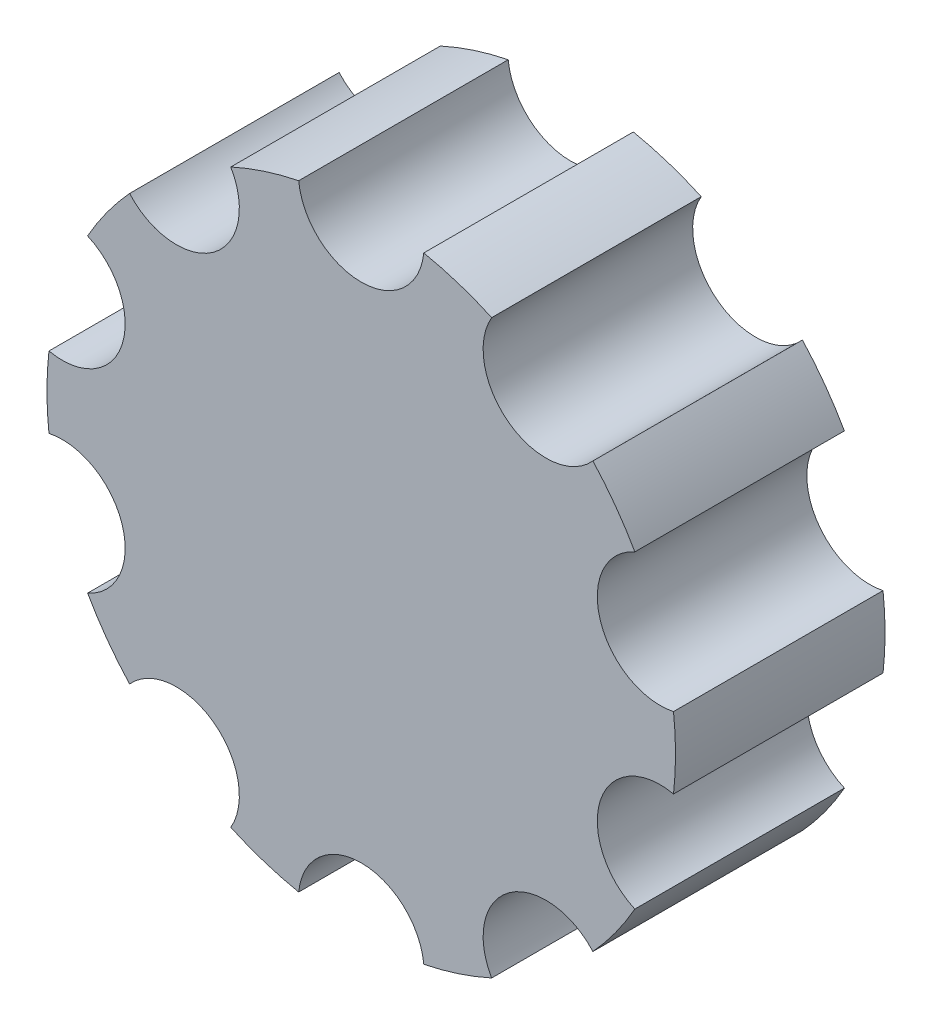
ISO-10303-21;
HEADER;
FILE_DESCRIPTION(('STEP AP214'),'2;1');
FILE_NAME('part.step','',(''),(''),'','','');
FILE_SCHEMA(('AUTOMOTIVE_DESIGN { 1 0 10303 214 1 1 1 1 }'));
ENDSEC;
DATA;
#1=APPLICATION_CONTEXT('core data for automotive mechanical design processes');
#2=APPLICATION_PROTOCOL_DEFINITION('international standard','automotive_design',2000,#1);
#3=PRODUCT_CONTEXT('',#1,'mechanical');
#4=PRODUCT('Part','Part','',(#3));
#5=PRODUCT_RELATED_PRODUCT_CATEGORY('part','',(#4));
#6=PRODUCT_DEFINITION_FORMATION('','',#4);
#7=PRODUCT_DEFINITION_CONTEXT('part definition',#1,'design');
#8=PRODUCT_DEFINITION('design','',#6,#7);
#9=PRODUCT_DEFINITION_SHAPE('','',#8);
#10=(LENGTH_UNIT() NAMED_UNIT(*) SI_UNIT(.MILLI.,.METRE.));
#11=(NAMED_UNIT(*) PLANE_ANGLE_UNIT() SI_UNIT($,.RADIAN.));
#12=(NAMED_UNIT(*) SI_UNIT($,.STERADIAN.) SOLID_ANGLE_UNIT());
#13=UNCERTAINTY_MEASURE_WITH_UNIT(LENGTH_MEASURE(1.E-05),#10,'distance_accuracy_value','');
#14=(GEOMETRIC_REPRESENTATION_CONTEXT(3) GLOBAL_UNCERTAINTY_ASSIGNED_CONTEXT((#13)) GLOBAL_UNIT_ASSIGNED_CONTEXT((#10,
#11,#12)) REPRESENTATION_CONTEXT('',''));
#15=CARTESIAN_POINT('',(0.,0.,0.));
#16=DIRECTION('',(0.,0.,1.));
#17=DIRECTION('',(1.,0.,0.));
#18=AXIS2_PLACEMENT_3D('',#15,#16,#17);
#19=CARTESIAN_POINT('',(0.,0.,5.));
#20=DIRECTION('',(0.,0.,-1.));
#21=DIRECTION('',(-1.,0.,0.));
#22=AXIS2_PLACEMENT_3D('',#19,#20,#21);
#23=CYLINDRICAL_SURFACE('',#22,7.5);
#24=CARTESIAN_POINT('',(0.,0.,0.));
#25=DIRECTION('',(0.,0.,1.));
#26=DIRECTION('',(1.,0.,0.));
#27=AXIS2_PLACEMENT_3D('',#24,#25,#26);
#28=CIRCLE('',#27,7.5);
#29=CARTESIAN_POINT('',(-1.49248115565993,7.35,0.));
#30=VERTEX_POINT('',#29);
#31=CARTESIAN_POINT('',(-3.11277898563617,6.82353332127732,0.));
#32=VERTEX_POINT('',#31);
#33=EDGE_CURVE('E182',#30,#32,#28,.T.);
#34=ORIENTED_EDGE('',*,*,#33,.T.);
#35=DIRECTION('',(0.,0.,1.));
#36=VECTOR('',#35,1.);
#37=CARTESIAN_POINT('',(-3.11277898563617,6.82353332127732,2.5));
#38=LINE('',#37,#36);
#39=CARTESIAN_POINT('',(-3.11277898563617,6.82353332127732,5.));
#40=VERTEX_POINT('',#39);
#41=EDGE_CURVE('E48',#32,#40,#38,.T.);
#42=ORIENTED_EDGE('',*,*,#41,.T.);
#43=CARTESIAN_POINT('',(0.,0.,5.));
#44=DIRECTION('',(0.,0.,1.));
#45=DIRECTION('',(1.,0.,0.));
#46=AXIS2_PLACEMENT_3D('',#43,#44,#45);
#47=CIRCLE('',#46,7.5);
#48=CARTESIAN_POINT('',(-1.49248115565993,7.35,5.));
#49=VERTEX_POINT('',#48);
#50=EDGE_CURVE('E190',#49,#40,#47,.T.);
#51=ORIENTED_EDGE('',*,*,#50,.F.);
#52=DIRECTION('',(0.,0.,1.));
#53=VECTOR('',#52,1.);
#54=CARTESIAN_POINT('',(-1.49248115565993,7.35,2.5));
#55=LINE('',#54,#53);
#56=EDGE_CURVE('E288',#49,#30,#55,.F.);
#57=ORIENTED_EDGE('',*,*,#56,.T.);
#58=EDGE_LOOP('',(#34,#42,#51,#57));
#59=FACE_BOUND('',#58,.T.);
#60=ADVANCED_FACE('F33',(#59),#23,.T.);
#61=CARTESIAN_POINT('',(-5.52766422306334,5.06901649603408,5.));
#62=VERTEX_POINT('',#61);
#63=CARTESIAN_POINT('',(-6.52906335388591,3.69070883719429,5.));
#64=VERTEX_POINT('',#63);
#65=EDGE_CURVE('E176',#62,#64,#47,.T.);
#66=ORIENTED_EDGE('',*,*,#65,.F.);
#67=DIRECTION('',(0.,0.,1.));
#68=VECTOR('',#67,1.);
#69=CARTESIAN_POINT('',(-5.52766422306334,5.06901649603408,2.5));
#70=LINE('',#69,#68);
#71=CARTESIAN_POINT('',(-5.52766422306334,5.06901649603408,0.));
#72=VERTEX_POINT('',#71);
#73=EDGE_CURVE('E169',#62,#72,#70,.F.);
#74=ORIENTED_EDGE('',*,*,#73,.T.);
#75=CARTESIAN_POINT('',(-6.52906335388592,3.69070883719429,0.));
#76=VERTEX_POINT('',#75);
#77=EDGE_CURVE('E55',#72,#76,#28,.T.);
#78=ORIENTED_EDGE('',*,*,#77,.T.);
#79=DIRECTION('',(0.,0.,1.));
#80=VECTOR('',#79,1.);
#81=CARTESIAN_POINT('',(-6.52906335388591,3.69070883719429,2.5));
#82=LINE('',#81,#80);
#83=EDGE_CURVE('E217',#76,#64,#82,.T.);
#84=ORIENTED_EDGE('',*,*,#83,.T.);
#85=EDGE_LOOP('',(#66,#74,#78,#84));
#86=FACE_BOUND('',#85,.T.);
#87=ADVANCED_FACE('F175',(#86),#23,.T.);
#88=CARTESIAN_POINT('',(-7.45146743565283,0.851840980116218,5.));
#89=VERTEX_POINT('',#88);
#90=CARTESIAN_POINT('',(-7.4514674356527,-0.851840980117424,5.));
#91=VERTEX_POINT('',#90);
#92=EDGE_CURVE('E343',#89,#91,#47,.T.);
#93=ORIENTED_EDGE('',*,*,#92,.F.);
#94=DIRECTION('',(0.,0.,1.));
#95=VECTOR('',#94,1.);
#96=CARTESIAN_POINT('',(-7.45146743565283,0.851840980116218,2.5));
#97=LINE('',#96,#95);
#98=CARTESIAN_POINT('',(-7.45146743565283,0.851840980116218,0.));
#99=VERTEX_POINT('',#98);
#100=EDGE_CURVE('E382',#89,#99,#97,.F.);
#101=ORIENTED_EDGE('',*,*,#100,.T.);
#102=CARTESIAN_POINT('',(-7.4514674356527,-0.851840980117422,0.));
#103=VERTEX_POINT('',#102);
#104=EDGE_CURVE('E183',#99,#103,#28,.T.);
#105=ORIENTED_EDGE('',*,*,#104,.T.);
#106=DIRECTION('',(0.,0.,1.));
#107=VECTOR('',#106,1.);
#108=CARTESIAN_POINT('',(-7.4514674356527,-0.851840980117424,2.5));
#109=LINE('',#108,#107);
#110=EDGE_CURVE('E206',#103,#91,#109,.T.);
#111=ORIENTED_EDGE('',*,*,#110,.T.);
#112=EDGE_LOOP('',(#93,#101,#105,#111));
#113=FACE_BOUND('',#112,.T.);
#114=ADVANCED_FACE('F366',(#113),#23,.T.);
#115=CARTESIAN_POINT('',(-6.52906335388483,-3.6907088371962,5.));
#116=VERTEX_POINT('',#115);
#117=CARTESIAN_POINT('',(-5.52766422306306,-5.06901649603438,5.));
#118=VERTEX_POINT('',#117);
#119=EDGE_CURVE('E212',#116,#118,#47,.T.);
#120=ORIENTED_EDGE('',*,*,#119,.F.);
#121=DIRECTION('',(0.,0.,1.));
#122=VECTOR('',#121,1.);
#123=CARTESIAN_POINT('',(-6.52906335388483,-3.6907088371962,2.5));
#124=LINE('',#123,#122);
#125=CARTESIAN_POINT('',(-6.52906335388483,-3.6907088371962,0.));
#126=VERTEX_POINT('',#125);
#127=EDGE_CURVE('E203',#116,#126,#124,.F.);
#128=ORIENTED_EDGE('',*,*,#127,.T.);
#129=CARTESIAN_POINT('',(-5.52766422306306,-5.06901649603438,0.));
#130=VERTEX_POINT('',#129);
#131=EDGE_CURVE('E187',#126,#130,#28,.T.);
#132=ORIENTED_EDGE('',*,*,#131,.T.);
#133=DIRECTION('',(0.,0.,1.));
#134=VECTOR('',#133,1.);
#135=CARTESIAN_POINT('',(-5.52766422306306,-5.06901649603438,2.5));
#136=LINE('',#135,#134);
#137=EDGE_CURVE('E226',#130,#118,#136,.T.);
#138=ORIENTED_EDGE('',*,*,#137,.T.);
#139=EDGE_LOOP('',(#120,#128,#132,#138));
#140=FACE_BOUND('',#139,.T.);
#141=ADVANCED_FACE('F209',(#140),#23,.T.);
#142=CARTESIAN_POINT('',(-3.11277898563345,-6.82353332127856,5.));
#143=VERTEX_POINT('',#142);
#144=CARTESIAN_POINT('',(-1.49248115565991,-7.35,5.));
#145=VERTEX_POINT('',#144);
#146=EDGE_CURVE('E334',#143,#145,#47,.T.);
#147=ORIENTED_EDGE('',*,*,#146,.F.);
#148=DIRECTION('',(0.,0.,1.));
#149=VECTOR('',#148,1.);
#150=CARTESIAN_POINT('',(-3.11277898563345,-6.82353332127856,2.5));
#151=LINE('',#150,#149);
#152=CARTESIAN_POINT('',(-3.11277898563345,-6.82353332127856,0.));
#153=VERTEX_POINT('',#152);
#154=EDGE_CURVE('E223',#143,#153,#151,.F.);
#155=ORIENTED_EDGE('',*,*,#154,.T.);
#156=CARTESIAN_POINT('',(-1.49248115565991,-7.35,0.));
#157=VERTEX_POINT('',#156);
#158=EDGE_CURVE('E309',#153,#157,#28,.T.);
#159=ORIENTED_EDGE('',*,*,#158,.T.);
#160=DIRECTION('',(0.,0.,1.));
#161=VECTOR('',#160,1.);
#162=CARTESIAN_POINT('',(-1.49248115565991,-7.35,2.5));
#163=LINE('',#162,#161);
#164=EDGE_CURVE('E236',#157,#145,#163,.T.);
#165=ORIENTED_EDGE('',*,*,#164,.T.);
#166=EDGE_LOOP('',(#147,#155,#159,#165));
#167=FACE_BOUND('',#166,.T.);
#168=ADVANCED_FACE('F317',(#167),#23,.T.);
#169=CARTESIAN_POINT('',(1.49248115566325,-7.34999999999932,5.));
#170=VERTEX_POINT('',#169);
#171=CARTESIAN_POINT('',(3.11277898563663,-6.82353332127711,5.));
#172=VERTEX_POINT('',#171);
#173=EDGE_CURVE('E332',#170,#172,#47,.T.);
#174=ORIENTED_EDGE('',*,*,#173,.F.);
#175=DIRECTION('',(0.,0.,1.));
#176=VECTOR('',#175,1.);
#177=CARTESIAN_POINT('',(1.49248115566325,-7.34999999999932,2.5));
#178=LINE('',#177,#176);
#179=CARTESIAN_POINT('',(1.49248115566325,-7.34999999999932,0.));
#180=VERTEX_POINT('',#179);
#181=EDGE_CURVE('E233',#170,#180,#178,.F.);
#182=ORIENTED_EDGE('',*,*,#181,.T.);
#183=CARTESIAN_POINT('',(3.11277898563663,-6.82353332127711,0.));
#184=VERTEX_POINT('',#183);
#185=EDGE_CURVE('E305',#180,#184,#28,.T.);
#186=ORIENTED_EDGE('',*,*,#185,.T.);
#187=DIRECTION('',(0.,0.,1.));
#188=VECTOR('',#187,1.);
#189=CARTESIAN_POINT('',(3.11277898563663,-6.82353332127711,2.5));
#190=LINE('',#189,#188);
#191=EDGE_CURVE('E247',#184,#172,#190,.T.);
#192=ORIENTED_EDGE('',*,*,#191,.T.);
#193=EDGE_LOOP('',(#174,#182,#186,#192));
#194=FACE_BOUND('',#193,.T.);
#195=ADVANCED_FACE('F396',(#194),#23,.T.);
#196=CARTESIAN_POINT('',(5.52766422306486,-5.06901649603242,5.));
#197=VERTEX_POINT('',#196);
#198=CARTESIAN_POINT('',(6.52906335388626,-3.69070883719367,5.));
#199=VERTEX_POINT('',#198);
#200=EDGE_CURVE('E329',#197,#199,#47,.T.);
#201=ORIENTED_EDGE('',*,*,#200,.F.);
#202=DIRECTION('',(0.,0.,1.));
#203=VECTOR('',#202,1.);
#204=CARTESIAN_POINT('',(5.52766422306486,-5.06901649603242,2.5));
#205=LINE('',#204,#203);
#206=CARTESIAN_POINT('',(5.52766422306486,-5.06901649603242,0.));
#207=VERTEX_POINT('',#206);
#208=EDGE_CURVE('E244',#197,#207,#205,.F.);
#209=ORIENTED_EDGE('',*,*,#208,.T.);
#210=CARTESIAN_POINT('',(6.52906335388626,-3.69070883719367,0.));
#211=VERTEX_POINT('',#210);
#212=EDGE_CURVE('E301',#207,#211,#28,.T.);
#213=ORIENTED_EDGE('',*,*,#212,.T.);
#214=DIRECTION('',(0.,0.,1.));
#215=VECTOR('',#214,1.);
#216=CARTESIAN_POINT('',(6.52906335388626,-3.69070883719367,2.5));
#217=LINE('',#216,#215);
#218=EDGE_CURVE('E258',#211,#199,#217,.T.);
#219=ORIENTED_EDGE('',*,*,#218,.T.);
#220=EDGE_LOOP('',(#201,#209,#213,#219));
#221=FACE_BOUND('',#220,.T.);
#222=ADVANCED_FACE('F328',(#221),#23,.T.);
#223=CARTESIAN_POINT('',(7.45146743565287,-0.851840980115878,5.));
#224=VERTEX_POINT('',#223);
#225=CARTESIAN_POINT('',(7.45146743565262,0.851840980118086,5.));
#226=VERTEX_POINT('',#225);
#227=EDGE_CURVE('E333',#224,#226,#47,.T.);
#228=ORIENTED_EDGE('',*,*,#227,.F.);
#229=DIRECTION('',(0.,0.,1.));
#230=VECTOR('',#229,1.);
#231=CARTESIAN_POINT('',(7.45146743565287,-0.851840980115879,2.5));
#232=LINE('',#231,#230);
#233=CARTESIAN_POINT('',(7.45146743565287,-0.851840980115878,0.));
#234=VERTEX_POINT('',#233);
#235=EDGE_CURVE('E255',#224,#234,#232,.F.);
#236=ORIENTED_EDGE('',*,*,#235,.T.);
#237=CARTESIAN_POINT('',(7.45146743565262,0.851840980118086,0.));
#238=VERTEX_POINT('',#237);
#239=EDGE_CURVE('E297',#234,#238,#28,.T.);
#240=ORIENTED_EDGE('',*,*,#239,.T.);
#241=DIRECTION('',(0.,0.,1.));
#242=VECTOR('',#241,1.);
#243=CARTESIAN_POINT('',(7.45146743565262,0.851840980118086,2.5));
#244=LINE('',#243,#242);
#245=EDGE_CURVE('E269',#238,#226,#244,.T.);
#246=ORIENTED_EDGE('',*,*,#245,.T.);
#247=EDGE_LOOP('',(#228,#236,#240,#246));
#248=FACE_BOUND('',#247,.T.);
#249=ADVANCED_FACE('F374',(#248),#23,.T.);
#250=CARTESIAN_POINT('',(6.52906335388568,3.69070883719471,5.));
#251=VERTEX_POINT('',#250);
#252=CARTESIAN_POINT('',(5.52766422306279,5.06901649603467,5.));
#253=VERTEX_POINT('',#252);
#254=EDGE_CURVE('E335',#251,#253,#47,.T.);
#255=ORIENTED_EDGE('',*,*,#254,.F.);
#256=DIRECTION('',(0.,0.,1.));
#257=VECTOR('',#256,1.);
#258=CARTESIAN_POINT('',(6.52906335388568,3.69070883719471,2.5));
#259=LINE('',#258,#257);
#260=CARTESIAN_POINT('',(6.52906335388568,3.69070883719471,0.));
#261=VERTEX_POINT('',#260);
#262=EDGE_CURVE('E266',#251,#261,#259,.F.);
#263=ORIENTED_EDGE('',*,*,#262,.T.);
#264=CARTESIAN_POINT('',(5.52766422306279,5.06901649603467,0.));
#265=VERTEX_POINT('',#264);
#266=EDGE_CURVE('E295',#261,#265,#28,.T.);
#267=ORIENTED_EDGE('',*,*,#266,.T.);
#268=DIRECTION('',(0.,0.,1.));
#269=VECTOR('',#268,1.);
#270=CARTESIAN_POINT('',(5.52766422306279,5.06901649603467,2.5));
#271=LINE('',#270,#269);
#272=EDGE_CURVE('E280',#265,#253,#271,.T.);
#273=ORIENTED_EDGE('',*,*,#272,.T.);
#274=EDGE_LOOP('',(#255,#263,#267,#273));
#275=FACE_BOUND('',#274,.T.);
#276=ADVANCED_FACE('F368',(#275),#23,.T.);
#277=CARTESIAN_POINT('',(3.11277898563631,6.82353332127725,5.));
#278=VERTEX_POINT('',#277);
#279=CARTESIAN_POINT('',(1.49248115565993,7.35,5.));
#280=VERTEX_POINT('',#279);
#281=EDGE_CURVE('E185',#278,#280,#47,.T.);
#282=ORIENTED_EDGE('',*,*,#281,.F.);
#283=DIRECTION('',(0.,0.,1.));
#284=VECTOR('',#283,1.);
#285=CARTESIAN_POINT('',(3.11277898563631,6.82353332127725,2.5));
#286=LINE('',#285,#284);
#287=CARTESIAN_POINT('',(3.11277898563631,6.82353332127725,0.));
#288=VERTEX_POINT('',#287);
#289=EDGE_CURVE('E277',#278,#288,#286,.F.);
#290=ORIENTED_EDGE('',*,*,#289,.T.);
#291=CARTESIAN_POINT('',(1.49248115565993,7.35,0.));
#292=VERTEX_POINT('',#291);
#293=EDGE_CURVE('E186',#288,#292,#28,.T.);
#294=ORIENTED_EDGE('',*,*,#293,.T.);
#295=DIRECTION('',(0.,0.,1.));
#296=VECTOR('',#295,1.);
#297=CARTESIAN_POINT('',(1.49248115565993,7.35,2.5));
#298=LINE('',#297,#296);
#299=EDGE_CURVE('E290',#292,#280,#298,.T.);
#300=ORIENTED_EDGE('',*,*,#299,.T.);
#301=EDGE_LOOP('',(#282,#290,#294,#300));
#302=FACE_BOUND('',#301,.T.);
#303=ADVANCED_FACE('F35',(#302),#23,.T.);
#304=CARTESIAN_POINT('',(0.,0.,5.));
#305=DIRECTION('',(0.,0.,1.));
#306=DIRECTION('',(1.,0.,0.));
#307=AXIS2_PLACEMENT_3D('',#304,#305,#306);
#308=PLANE('',#307);
#309=CARTESIAN_POINT('',(-4.40838939219339,6.0676274578116,5.));
#310=DIRECTION('',(0.,0.,1.));
#311=DIRECTION('',(1.,0.,0.));
#312=AXIS2_PLACEMENT_3D('',#309,#310,#311);
#313=CIRCLE('',#312,1.5000000000004);
#314=EDGE_CURVE('E177',#62,#40,#313,.T.);
#315=ORIENTED_EDGE('',*,*,#314,.F.);
#316=ORIENTED_EDGE('',*,*,#65,.T.);
#317=CARTESIAN_POINT('',(-7.13292387221306,2.31762745781129,5.));
#318=DIRECTION('',(0.,0.,1.));
#319=DIRECTION('',(1.,0.,0.));
#320=AXIS2_PLACEMENT_3D('',#317,#318,#319);
#321=CIRCLE('',#320,1.50000000000088);
#322=EDGE_CURVE('E380',#89,#64,#321,.T.);
#323=ORIENTED_EDGE('',*,*,#322,.F.);
#324=ORIENTED_EDGE('',*,*,#92,.T.);
#325=CARTESIAN_POINT('',(-7.13292387221254,-2.31762745781292,5.));
#326=DIRECTION('',(0.,0.,1.));
#327=DIRECTION('',(1.,0.,0.));
#328=AXIS2_PLACEMENT_3D('',#325,#326,#327);
#329=CIRCLE('',#328,1.50000000000137);
#330=EDGE_CURVE('E213',#116,#91,#329,.T.);
#331=ORIENTED_EDGE('',*,*,#330,.F.);
#332=ORIENTED_EDGE('',*,*,#119,.T.);
#333=CARTESIAN_POINT('',(-4.40838939219201,-6.06762745781261,5.));
#334=DIRECTION('',(0.,0.,1.));
#335=DIRECTION('',(1.,0.,0.));
#336=AXIS2_PLACEMENT_3D('',#333,#334,#335);
#337=CIRCLE('',#336,1.50000000000168);
#338=EDGE_CURVE('E215',#143,#118,#337,.T.);
#339=ORIENTED_EDGE('',*,*,#338,.F.);
#340=ORIENTED_EDGE('',*,*,#146,.T.);
#341=CARTESIAN_POINT('',(1.70346559562552E-12,-7.5,5.));
#342=DIRECTION('',(0.,0.,1.));
#343=DIRECTION('',(1.,0.,0.));
#344=AXIS2_PLACEMENT_3D('',#341,#342,#343);
#345=CIRCLE('',#344,1.50000000000168);
#346=EDGE_CURVE('E228',#170,#145,#345,.T.);
#347=ORIENTED_EDGE('',*,*,#346,.F.);
#348=ORIENTED_EDGE('',*,*,#173,.T.);
#349=CARTESIAN_POINT('',(4.40838939219509,-6.0676274578116,5.));
#350=DIRECTION('',(0.,0.,1.));
#351=DIRECTION('',(1.,0.,0.));
#352=AXIS2_PLACEMENT_3D('',#349,#350,#351);
#353=CIRCLE('',#352,1.50000000000137);
#354=EDGE_CURVE('E239',#197,#172,#353,.T.);
#355=ORIENTED_EDGE('',*,*,#354,.F.);
#356=ORIENTED_EDGE('',*,*,#200,.T.);
#357=CARTESIAN_POINT('',(7.13292387221477,-2.3176274578113,5.));
#358=DIRECTION('',(0.,0.,1.));
#359=DIRECTION('',(1.,0.,0.));
#360=AXIS2_PLACEMENT_3D('',#357,#358,#359);
#361=CIRCLE('',#360,1.50000000000086);
#362=EDGE_CURVE('E250',#224,#199,#361,.T.);
#363=ORIENTED_EDGE('',*,*,#362,.F.);
#364=ORIENTED_EDGE('',*,*,#227,.T.);
#365=CARTESIAN_POINT('',(7.13292387221424,2.31762745781292,5.));
#366=DIRECTION('',(0.,0.,1.));
#367=DIRECTION('',(1.,0.,0.));
#368=AXIS2_PLACEMENT_3D('',#365,#366,#367);
#369=CIRCLE('',#368,1.50000000000035);
#370=EDGE_CURVE('E261',#251,#226,#369,.T.);
#371=ORIENTED_EDGE('',*,*,#370,.F.);
#372=ORIENTED_EDGE('',*,*,#254,.T.);
#373=CARTESIAN_POINT('',(4.40838939219371,6.06762745781261,5.));
#374=DIRECTION('',(0.,0.,1.));
#375=DIRECTION('',(1.,0.,0.));
#376=AXIS2_PLACEMENT_3D('',#373,#374,#375);
#377=CIRCLE('',#376,1.50000000000002);
#378=EDGE_CURVE('E272',#278,#253,#377,.T.);
#379=ORIENTED_EDGE('',*,*,#378,.F.);
#380=ORIENTED_EDGE('',*,*,#281,.T.);
#381=CARTESIAN_POINT('',(0.,7.5,5.));
#382=DIRECTION('',(0.,0.,1.));
#383=DIRECTION('',(1.,0.,0.));
#384=AXIS2_PLACEMENT_3D('',#381,#382,#383);
#385=CIRCLE('',#384,1.5);
#386=EDGE_CURVE('E283',#49,#280,#385,.T.);
#387=ORIENTED_EDGE('',*,*,#386,.F.);
#388=ORIENTED_EDGE('',*,*,#50,.T.);
#389=EDGE_LOOP('',(#315,#316,#323,#324,#331,#332,#339,#340,#347,#348,#355,#356,#363,#364,#371,
#372,#379,#380,#387,#388));
#390=FACE_BOUND('',#389,.T.);
#391=ADVANCED_FACE('F348',(#390),#308,.T.);
#392=CARTESIAN_POINT('',(0.,0.,0.));
#393=DIRECTION('',(0.,0.,1.));
#394=DIRECTION('',(1.,0.,0.));
#395=AXIS2_PLACEMENT_3D('',#392,#393,#394);
#396=PLANE('',#395);
#397=ORIENTED_EDGE('',*,*,#77,.F.);
#398=CARTESIAN_POINT('',(-4.40838939219339,6.0676274578116,0.));
#399=DIRECTION('',(0.,0.,1.));
#400=DIRECTION('',(1.,0.,0.));
#401=AXIS2_PLACEMENT_3D('',#398,#399,#400);
#402=CIRCLE('',#401,1.5000000000004);
#403=EDGE_CURVE('E11',#72,#32,#402,.T.);
#404=ORIENTED_EDGE('',*,*,#403,.T.);
#405=ORIENTED_EDGE('',*,*,#33,.F.);
#406=CARTESIAN_POINT('',(0.,7.5,0.));
#407=DIRECTION('',(0.,0.,1.));
#408=DIRECTION('',(1.,0.,0.));
#409=AXIS2_PLACEMENT_3D('',#406,#407,#408);
#410=CIRCLE('',#409,1.5);
#411=EDGE_CURVE('E286',#292,#30,#410,.F.);
#412=ORIENTED_EDGE('',*,*,#411,.F.);
#413=ORIENTED_EDGE('',*,*,#293,.F.);
#414=CARTESIAN_POINT('',(4.40838939219371,6.06762745781261,0.));
#415=DIRECTION('',(0.,0.,1.));
#416=DIRECTION('',(1.,0.,0.));
#417=AXIS2_PLACEMENT_3D('',#414,#415,#416);
#418=CIRCLE('',#417,1.50000000000002);
#419=EDGE_CURVE('E275',#265,#288,#418,.F.);
#420=ORIENTED_EDGE('',*,*,#419,.F.);
#421=ORIENTED_EDGE('',*,*,#266,.F.);
#422=CARTESIAN_POINT('',(7.13292387221424,2.31762745781292,0.));
#423=DIRECTION('',(0.,0.,1.));
#424=DIRECTION('',(1.,0.,0.));
#425=AXIS2_PLACEMENT_3D('',#422,#423,#424);
#426=CIRCLE('',#425,1.50000000000035);
#427=EDGE_CURVE('E264',#238,#261,#426,.F.);
#428=ORIENTED_EDGE('',*,*,#427,.F.);
#429=ORIENTED_EDGE('',*,*,#239,.F.);
#430=CARTESIAN_POINT('',(7.13292387221477,-2.3176274578113,0.));
#431=DIRECTION('',(0.,0.,1.));
#432=DIRECTION('',(1.,0.,0.));
#433=AXIS2_PLACEMENT_3D('',#430,#431,#432);
#434=CIRCLE('',#433,1.50000000000086);
#435=EDGE_CURVE('E253',#211,#234,#434,.F.);
#436=ORIENTED_EDGE('',*,*,#435,.F.);
#437=ORIENTED_EDGE('',*,*,#212,.F.);
#438=CARTESIAN_POINT('',(4.40838939219509,-6.0676274578116,0.));
#439=DIRECTION('',(0.,0.,1.));
#440=DIRECTION('',(1.,0.,0.));
#441=AXIS2_PLACEMENT_3D('',#438,#439,#440);
#442=CIRCLE('',#441,1.50000000000137);
#443=EDGE_CURVE('E242',#184,#207,#442,.F.);
#444=ORIENTED_EDGE('',*,*,#443,.F.);
#445=ORIENTED_EDGE('',*,*,#185,.F.);
#446=CARTESIAN_POINT('',(1.70346559562552E-12,-7.5,0.));
#447=DIRECTION('',(0.,0.,1.));
#448=DIRECTION('',(1.,0.,0.));
#449=AXIS2_PLACEMENT_3D('',#446,#447,#448);
#450=CIRCLE('',#449,1.50000000000168);
#451=EDGE_CURVE('E231',#157,#180,#450,.F.);
#452=ORIENTED_EDGE('',*,*,#451,.F.);
#453=ORIENTED_EDGE('',*,*,#158,.F.);
#454=CARTESIAN_POINT('',(-4.40838939219201,-6.06762745781261,0.));
#455=DIRECTION('',(0.,0.,1.));
#456=DIRECTION('',(1.,0.,0.));
#457=AXIS2_PLACEMENT_3D('',#454,#455,#456);
#458=CIRCLE('',#457,1.50000000000168);
#459=EDGE_CURVE('E192',#153,#130,#458,.T.);
#460=ORIENTED_EDGE('',*,*,#459,.T.);
#461=ORIENTED_EDGE('',*,*,#131,.F.);
#462=CARTESIAN_POINT('',(-7.13292387221254,-2.31762745781292,0.));
#463=DIRECTION('',(0.,0.,1.));
#464=DIRECTION('',(1.,0.,0.));
#465=AXIS2_PLACEMENT_3D('',#462,#463,#464);
#466=CIRCLE('',#465,1.50000000000137);
#467=EDGE_CURVE('E195',#126,#103,#466,.T.);
#468=ORIENTED_EDGE('',*,*,#467,.T.);
#469=ORIENTED_EDGE('',*,*,#104,.F.);
#470=CARTESIAN_POINT('',(-7.13292387221306,2.31762745781129,0.));
#471=DIRECTION('',(0.,0.,1.));
#472=DIRECTION('',(1.,0.,0.));
#473=AXIS2_PLACEMENT_3D('',#470,#471,#472);
#474=CIRCLE('',#473,1.50000000000088);
#475=EDGE_CURVE('E41',#99,#76,#474,.T.);
#476=ORIENTED_EDGE('',*,*,#475,.T.);
#477=EDGE_LOOP('',(#397,#404,#405,#412,#413,#420,#421,#428,#429,#436,#437,#444,#445,#452,#453,
#460,#461,#468,#469,#476));
#478=FACE_BOUND('',#477,.T.);
#479=ADVANCED_FACE('F180',(#478),#396,.F.);
#480=CARTESIAN_POINT('',(0.,7.5,-4.24264068712404));
#481=DIRECTION('',(0.,0.,1.));
#482=DIRECTION('',(1.,0.,0.));
#483=AXIS2_PLACEMENT_3D('',#480,#481,#482);
#484=CYLINDRICAL_SURFACE('',#483,1.5);
#485=ORIENTED_EDGE('',*,*,#411,.T.);
#486=ORIENTED_EDGE('',*,*,#56,.F.);
#487=ORIENTED_EDGE('',*,*,#386,.T.);
#488=ORIENTED_EDGE('',*,*,#299,.F.);
#489=EDGE_LOOP('',(#485,#486,#487,#488));
#490=FACE_BOUND('',#489,.T.);
#491=ADVANCED_FACE('F379',(#490),#484,.F.);
#492=CARTESIAN_POINT('',(4.40838939219371,6.06762745781261,-4.24264068712404));
#493=DIRECTION('',(0.,0.,1.));
#494=DIRECTION('',(1.,0.,0.));
#495=AXIS2_PLACEMENT_3D('',#492,#493,#494);
#496=CYLINDRICAL_SURFACE('',#495,1.50000000000002);
#497=ORIENTED_EDGE('',*,*,#419,.T.);
#498=ORIENTED_EDGE('',*,*,#289,.F.);
#499=ORIENTED_EDGE('',*,*,#378,.T.);
#500=ORIENTED_EDGE('',*,*,#272,.F.);
#501=EDGE_LOOP('',(#497,#498,#499,#500));
#502=FACE_BOUND('',#501,.T.);
#503=ADVANCED_FACE('F420',(#502),#496,.F.);
#504=CARTESIAN_POINT('',(7.13292387221424,2.31762745781292,-4.24264068712404));
#505=DIRECTION('',(0.,0.,1.));
#506=DIRECTION('',(1.,0.,0.));
#507=AXIS2_PLACEMENT_3D('',#504,#505,#506);
#508=CYLINDRICAL_SURFACE('',#507,1.50000000000035);
#509=ORIENTED_EDGE('',*,*,#427,.T.);
#510=ORIENTED_EDGE('',*,*,#262,.F.);
#511=ORIENTED_EDGE('',*,*,#370,.T.);
#512=ORIENTED_EDGE('',*,*,#245,.F.);
#513=EDGE_LOOP('',(#509,#510,#511,#512));
#514=FACE_BOUND('',#513,.T.);
#515=ADVANCED_FACE('F410',(#514),#508,.F.);
#516=CARTESIAN_POINT('',(7.13292387221477,-2.3176274578113,-4.24264068712404));
#517=DIRECTION('',(0.,0.,1.));
#518=DIRECTION('',(1.,0.,0.));
#519=AXIS2_PLACEMENT_3D('',#516,#517,#518);
#520=CYLINDRICAL_SURFACE('',#519,1.50000000000086);
#521=ORIENTED_EDGE('',*,*,#435,.T.);
#522=ORIENTED_EDGE('',*,*,#235,.F.);
#523=ORIENTED_EDGE('',*,*,#362,.T.);
#524=ORIENTED_EDGE('',*,*,#218,.F.);
#525=EDGE_LOOP('',(#521,#522,#523,#524));
#526=FACE_BOUND('',#525,.T.);
#527=ADVANCED_FACE('F412',(#526),#520,.F.);
#528=CARTESIAN_POINT('',(4.40838939219509,-6.0676274578116,-4.24264068712404));
#529=DIRECTION('',(0.,0.,1.));
#530=DIRECTION('',(1.,0.,0.));
#531=AXIS2_PLACEMENT_3D('',#528,#529,#530);
#532=CYLINDRICAL_SURFACE('',#531,1.50000000000137);
#533=ORIENTED_EDGE('',*,*,#443,.T.);
#534=ORIENTED_EDGE('',*,*,#208,.F.);
#535=ORIENTED_EDGE('',*,*,#354,.T.);
#536=ORIENTED_EDGE('',*,*,#191,.F.);
#537=EDGE_LOOP('',(#533,#534,#535,#536));
#538=FACE_BOUND('',#537,.T.);
#539=ADVANCED_FACE('F325',(#538),#532,.F.);
#540=CARTESIAN_POINT('',(1.70346559562552E-12,-7.5,-4.24264068712404));
#541=DIRECTION('',(0.,0.,1.));
#542=DIRECTION('',(1.,0.,0.));
#543=AXIS2_PLACEMENT_3D('',#540,#541,#542);
#544=CYLINDRICAL_SURFACE('',#543,1.50000000000168);
#545=ORIENTED_EDGE('',*,*,#451,.T.);
#546=ORIENTED_EDGE('',*,*,#181,.F.);
#547=ORIENTED_EDGE('',*,*,#346,.T.);
#548=ORIENTED_EDGE('',*,*,#164,.F.);
#549=EDGE_LOOP('',(#545,#546,#547,#548));
#550=FACE_BOUND('',#549,.T.);
#551=ADVANCED_FACE('F320',(#550),#544,.F.);
#552=CARTESIAN_POINT('',(-4.40838939219201,-6.06762745781261,-4.24264068712404));
#553=DIRECTION('',(0.,0.,1.));
#554=DIRECTION('',(1.,0.,0.));
#555=AXIS2_PLACEMENT_3D('',#552,#553,#554);
#556=CYLINDRICAL_SURFACE('',#555,1.50000000000168);
#557=ORIENTED_EDGE('',*,*,#459,.F.);
#558=ORIENTED_EDGE('',*,*,#154,.F.);
#559=ORIENTED_EDGE('',*,*,#338,.T.);
#560=ORIENTED_EDGE('',*,*,#137,.F.);
#561=EDGE_LOOP('',(#557,#558,#559,#560));
#562=FACE_BOUND('',#561,.T.);
#563=ADVANCED_FACE('F351',(#562),#556,.F.);
#564=CARTESIAN_POINT('',(-7.13292387221254,-2.31762745781292,-4.24264068712404));
#565=DIRECTION('',(0.,0.,1.));
#566=DIRECTION('',(1.,0.,0.));
#567=AXIS2_PLACEMENT_3D('',#564,#565,#566);
#568=CYLINDRICAL_SURFACE('',#567,1.50000000000137);
#569=ORIENTED_EDGE('',*,*,#467,.F.);
#570=ORIENTED_EDGE('',*,*,#127,.F.);
#571=ORIENTED_EDGE('',*,*,#330,.T.);
#572=ORIENTED_EDGE('',*,*,#110,.F.);
#573=EDGE_LOOP('',(#569,#570,#571,#572));
#574=FACE_BOUND('',#573,.T.);
#575=ADVANCED_FACE('F201',(#574),#568,.F.);
#576=CARTESIAN_POINT('',(-7.13292387221306,2.31762745781129,-4.24264068712404));
#577=DIRECTION('',(0.,0.,1.));
#578=DIRECTION('',(1.,0.,0.));
#579=AXIS2_PLACEMENT_3D('',#576,#577,#578);
#580=CYLINDRICAL_SURFACE('',#579,1.50000000000088);
#581=ORIENTED_EDGE('',*,*,#475,.F.);
#582=ORIENTED_EDGE('',*,*,#100,.F.);
#583=ORIENTED_EDGE('',*,*,#322,.T.);
#584=ORIENTED_EDGE('',*,*,#83,.F.);
#585=EDGE_LOOP('',(#581,#582,#583,#584));
#586=FACE_BOUND('',#585,.T.);
#587=ADVANCED_FACE('F358',(#586),#580,.F.);
#588=CARTESIAN_POINT('',(-4.40838939219339,6.0676274578116,-4.24264068712404));
#589=DIRECTION('',(0.,0.,1.));
#590=DIRECTION('',(1.,0.,0.));
#591=AXIS2_PLACEMENT_3D('',#588,#589,#590);
#592=CYLINDRICAL_SURFACE('',#591,1.5000000000004);
#593=ORIENTED_EDGE('',*,*,#403,.F.);
#594=ORIENTED_EDGE('',*,*,#73,.F.);
#595=ORIENTED_EDGE('',*,*,#314,.T.);
#596=ORIENTED_EDGE('',*,*,#41,.F.);
#597=EDGE_LOOP('',(#593,#594,#595,#596));
#598=FACE_BOUND('',#597,.T.);
#599=ADVANCED_FACE('F168',(#598),#592,.F.);
#600=CLOSED_SHELL('',(#60,#87,#114,#141,#168,#195,#222,#249,#276,#303,#391,#479,#491,#503,#515,
#527,#539,#551,#563,#575,#587,#599));
#601=MANIFOLD_SOLID_BREP('B2',#600);
#602=ADVANCED_BREP_SHAPE_REPRESENTATION('',(#18,#601),#14);
#603=SHAPE_DEFINITION_REPRESENTATION(#9,#602);
ENDSEC;
END-ISO-10303-21;
